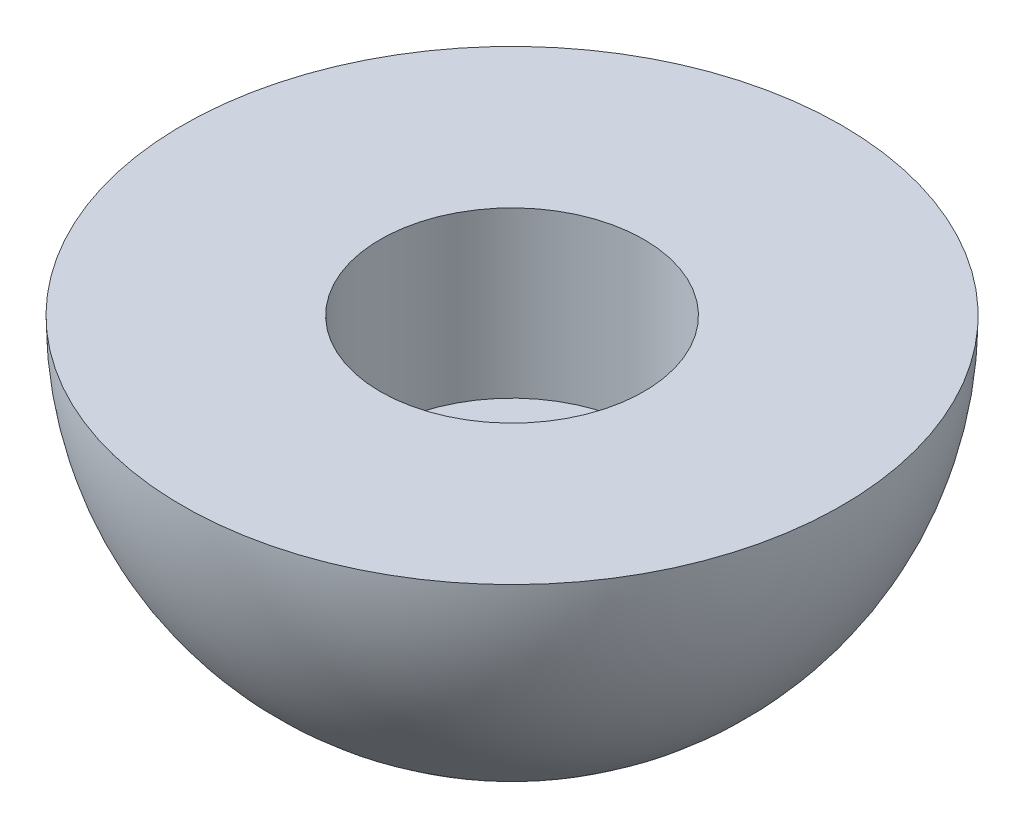
ISO-10303-21;
HEADER;
FILE_DESCRIPTION(('STEP AP214'),'2;1');
FILE_NAME('part.step','',(''),(''),'','','');
FILE_SCHEMA(('AUTOMOTIVE_DESIGN { 1 0 10303 214 1 1 1 1 }'));
ENDSEC;
DATA;
#1=APPLICATION_CONTEXT('core data for automotive mechanical design processes');
#2=APPLICATION_PROTOCOL_DEFINITION('international standard','automotive_design',2000,#1);
#3=PRODUCT_CONTEXT('',#1,'mechanical');
#4=PRODUCT('Part','Part','',(#3));
#5=PRODUCT_RELATED_PRODUCT_CATEGORY('part','',(#4));
#6=PRODUCT_DEFINITION_FORMATION('','',#4);
#7=PRODUCT_DEFINITION_CONTEXT('part definition',#1,'design');
#8=PRODUCT_DEFINITION('design','',#6,#7);
#9=PRODUCT_DEFINITION_SHAPE('','',#8);
#10=(LENGTH_UNIT() NAMED_UNIT(*) SI_UNIT(.MILLI.,.METRE.));
#11=(NAMED_UNIT(*) PLANE_ANGLE_UNIT() SI_UNIT($,.RADIAN.));
#12=(NAMED_UNIT(*) SI_UNIT($,.STERADIAN.) SOLID_ANGLE_UNIT());
#13=UNCERTAINTY_MEASURE_WITH_UNIT(LENGTH_MEASURE(1.E-05),#10,'distance_accuracy_value','');
#14=(GEOMETRIC_REPRESENTATION_CONTEXT(3) GLOBAL_UNCERTAINTY_ASSIGNED_CONTEXT((#13)) GLOBAL_UNIT_ASSIGNED_CONTEXT((#10,
#11,#12)) REPRESENTATION_CONTEXT('',''));
#15=CARTESIAN_POINT('',(0.,0.,0.));
#16=DIRECTION('',(0.,0.,1.));
#17=DIRECTION('',(1.,0.,0.));
#18=AXIS2_PLACEMENT_3D('',#15,#16,#17);
#19=CARTESIAN_POINT('',(0.,0.,0.));
#20=DIRECTION('',(0.,-1.,0.));
#21=DIRECTION('',(0.,0.,-1.));
#22=AXIS2_PLACEMENT_3D('',#19,#20,#21);
#23=PLANE('',#22);
#24=CARTESIAN_POINT('',(0.,0.,0.));
#25=DIRECTION('',(0.,-1.,0.));
#26=DIRECTION('',(0.,0.,-1.));
#27=AXIS2_PLACEMENT_3D('',#24,#25,#26);
#28=CIRCLE('',#27,10.);
#29=CARTESIAN_POINT('',(0.,0.,-10.));
#30=VERTEX_POINT('',#29);
#31=EDGE_CURVE('E10',#30,#30,#28,.T.);
#32=ORIENTED_EDGE('',*,*,#31,.F.);
#33=EDGE_LOOP('',(#32));
#34=FACE_BOUND('',#33,.T.);
#35=CARTESIAN_POINT('',(0.,1.2E-05,0.));
#36=DIRECTION('',(0.,1.,0.));
#37=DIRECTION('',(0.,0.,1.));
#38=AXIS2_PLACEMENT_3D('',#35,#36,#37);
#39=CIRCLE('',#38,4.);
#40=CARTESIAN_POINT('',(0.,1.20000000279319E-05,4.));
#41=VERTEX_POINT('',#40);
#42=EDGE_CURVE('E52',#41,#41,#39,.T.);
#43=ORIENTED_EDGE('',*,*,#42,.F.);
#44=EDGE_LOOP('',(#43));
#45=FACE_BOUND('',#44,.T.);
#46=ADVANCED_FACE('F43',(#34,#45),#23,.F.);
#47=CARTESIAN_POINT('',(0.,0.,0.));
#48=DIRECTION('',(1.,0.,0.));
#49=DIRECTION('',(0.,0.,-1.));
#50=AXIS2_PLACEMENT_3D('',#47,#48,#49);
#51=SPHERICAL_SURFACE('',#50,10.);
#52=CARTESIAN_POINT('',(0.,0.,0.));
#53=DIRECTION('',(0.,-1.,0.));
#54=DIRECTION('',(0.,0.,-1.));
#55=AXIS2_PLACEMENT_3D('',#52,#53,#54);
#56=SPHERICAL_SURFACE('',#55,10.);
#57=ORIENTED_EDGE('',*,*,#31,.T.);
#58=EDGE_LOOP('',(#57));
#59=FACE_BOUND('',#58,.T.);
#60=ADVANCED_FACE('F44',(#59),#56,.T.);
#61=CARTESIAN_POINT('',(0.,1.2E-05,0.));
#62=DIRECTION('',(0.,-1.,0.));
#63=DIRECTION('',(0.,0.,-1.));
#64=AXIS2_PLACEMENT_3D('',#61,#62,#63);
#65=CYLINDRICAL_SURFACE('',#64,4.);
#66=ORIENTED_EDGE('',*,*,#42,.T.);
#67=EDGE_LOOP('',(#66));
#68=FACE_BOUND('',#67,.T.);
#69=CARTESIAN_POINT('',(0.,-5.,0.));
#70=DIRECTION('',(0.,1.,0.));
#71=DIRECTION('',(0.,0.,1.));
#72=AXIS2_PLACEMENT_3D('',#69,#70,#71);
#73=CIRCLE('',#72,4.);
#74=CARTESIAN_POINT('',(0.,-4.99999999999997,4.00000000000003));
#75=VERTEX_POINT('',#74);
#76=EDGE_CURVE('E56',#75,#75,#73,.T.);
#77=ORIENTED_EDGE('',*,*,#76,.F.);
#78=EDGE_LOOP('',(#77));
#79=FACE_BOUND('',#78,.T.);
#80=ADVANCED_FACE('F66',(#68,#79),#65,.F.);
#81=CARTESIAN_POINT('',(0.,-5.,0.));
#82=DIRECTION('',(0.,1.,0.));
#83=DIRECTION('',(0.,0.,1.));
#84=AXIS2_PLACEMENT_3D('',#81,#82,#83);
#85=PLANE('',#84);
#86=ORIENTED_EDGE('',*,*,#76,.T.);
#87=EDGE_LOOP('',(#86));
#88=FACE_BOUND('',#87,.T.);
#89=ADVANCED_FACE('F74',(#88),#85,.T.);
#90=CLOSED_SHELL('',(#46,#60,#80,#89));
#91=MANIFOLD_SOLID_BREP('B2',#90);
#92=ADVANCED_BREP_SHAPE_REPRESENTATION('',(#18,#91),#14);
#93=SHAPE_DEFINITION_REPRESENTATION(#9,#92);
ENDSEC;
END-ISO-10303-21;
